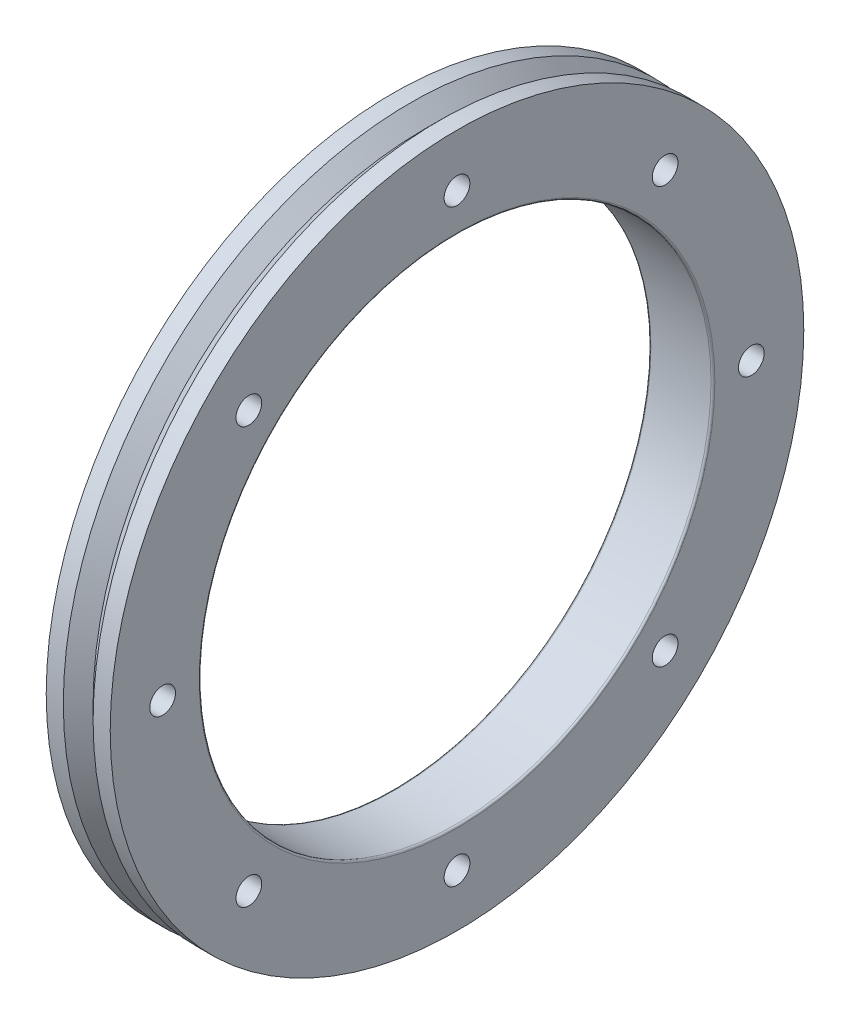
ISO-10303-21;
HEADER;
FILE_DESCRIPTION(('STEP AP214'),'2;1');
FILE_NAME('part.step','',(''),(''),'','','');
FILE_SCHEMA(('AUTOMOTIVE_DESIGN { 1 0 10303 214 1 1 1 1 }'));
ENDSEC;
DATA;
#1=APPLICATION_CONTEXT('core data for automotive mechanical design processes');
#2=APPLICATION_PROTOCOL_DEFINITION('international standard','automotive_design',2000,#1);
#3=PRODUCT_CONTEXT('',#1,'mechanical');
#4=PRODUCT('Part','Part','',(#3));
#5=PRODUCT_RELATED_PRODUCT_CATEGORY('part','',(#4));
#6=PRODUCT_DEFINITION_FORMATION('','',#4);
#7=PRODUCT_DEFINITION_CONTEXT('part definition',#1,'design');
#8=PRODUCT_DEFINITION('design','',#6,#7);
#9=PRODUCT_DEFINITION_SHAPE('','',#8);
#10=(LENGTH_UNIT() NAMED_UNIT(*) SI_UNIT(.MILLI.,.METRE.));
#11=(NAMED_UNIT(*) PLANE_ANGLE_UNIT() SI_UNIT($,.RADIAN.));
#12=(NAMED_UNIT(*) SI_UNIT($,.STERADIAN.) SOLID_ANGLE_UNIT());
#13=UNCERTAINTY_MEASURE_WITH_UNIT(LENGTH_MEASURE(1.E-05),#10,'distance_accuracy_value','');
#14=(GEOMETRIC_REPRESENTATION_CONTEXT(3) GLOBAL_UNCERTAINTY_ASSIGNED_CONTEXT((#13)) GLOBAL_UNIT_ASSIGNED_CONTEXT((#10,
#11,#12)) REPRESENTATION_CONTEXT('',''));
#15=CARTESIAN_POINT('',(0.,0.,0.));
#16=DIRECTION('',(0.,0.,1.));
#17=DIRECTION('',(1.,0.,0.));
#18=AXIS2_PLACEMENT_3D('',#15,#16,#17);
#19=CARTESIAN_POINT('',(5.,0.,0.));
#20=DIRECTION('',(1.,0.,0.));
#21=DIRECTION('',(0.,0.,-1.));
#22=AXIS2_PLACEMENT_3D('',#19,#20,#21);
#23=CYLINDRICAL_SURFACE('',#22,27.1);
#24=CARTESIAN_POINT('',(1.33578643762692,0.,0.));
#25=DIRECTION('',(1.,0.,0.));
#26=DIRECTION('',(0.,0.,1.));
#27=AXIS2_PLACEMENT_3D('',#24,#25,#26);
#28=CIRCLE('',#27,27.1);
#29=CARTESIAN_POINT('',(1.33578643762692,0.,27.1));
#30=VERTEX_POINT('',#29);
#31=EDGE_CURVE('E95',#30,#30,#28,.T.);
#32=ORIENTED_EDGE('',*,*,#31,.F.);
#33=EDGE_LOOP('',(#32));
#34=FACE_BOUND('',#33,.T.);
#35=CARTESIAN_POINT('',(0.,0.,0.));
#36=DIRECTION('',(1.,0.,0.));
#37=DIRECTION('',(0.,0.,-1.));
#38=AXIS2_PLACEMENT_3D('',#35,#36,#37);
#39=CIRCLE('',#38,27.1);
#40=CARTESIAN_POINT('',(0.,0.,-27.1));
#41=VERTEX_POINT('',#40);
#42=EDGE_CURVE('E92',#41,#41,#39,.T.);
#43=ORIENTED_EDGE('',*,*,#42,.T.);
#44=EDGE_LOOP('',(#43));
#45=FACE_BOUND('',#44,.T.);
#46=ADVANCED_FACE('F15',(#34,#45),#23,.T.);
#47=CARTESIAN_POINT('',(0.,27.1,0.));
#48=DIRECTION('',(-1.,0.,0.));
#49=DIRECTION('',(0.,0.,1.));
#50=AXIS2_PLACEMENT_3D('',#47,#48,#49);
#51=PLANE('',#50);
#52=CARTESIAN_POINT('',(0.,0.,23.));
#53=DIRECTION('',(1.,0.,0.));
#54=DIRECTION('',(0.,0.,-1.));
#55=AXIS2_PLACEMENT_3D('',#52,#53,#54);
#56=CIRCLE('',#55,1.0065);
#57=CARTESIAN_POINT('',(0.,0.,21.9935));
#58=VERTEX_POINT('',#57);
#59=EDGE_CURVE('E89',#58,#58,#56,.T.);
#60=ORIENTED_EDGE('',*,*,#59,.T.);
#61=EDGE_LOOP('',(#60));
#62=FACE_BOUND('',#61,.T.);
#63=CARTESIAN_POINT('',(0.,-16.263455967291,16.263455967291));
#64=DIRECTION('',(1.,0.,0.));
#65=DIRECTION('',(0.,0.,-1.));
#66=AXIS2_PLACEMENT_3D('',#63,#64,#65);
#67=CIRCLE('',#66,1.0065);
#68=CARTESIAN_POINT('',(0.,-16.263455967291,15.256955967291));
#69=VERTEX_POINT('',#68);
#70=EDGE_CURVE('E86',#69,#69,#67,.T.);
#71=ORIENTED_EDGE('',*,*,#70,.T.);
#72=EDGE_LOOP('',(#71));
#73=FACE_BOUND('',#72,.T.);
#74=CARTESIAN_POINT('',(0.,-23.,0.));
#75=DIRECTION('',(1.,0.,0.));
#76=DIRECTION('',(0.,0.,-1.));
#77=AXIS2_PLACEMENT_3D('',#74,#75,#76);
#78=CIRCLE('',#77,1.0065);
#79=CARTESIAN_POINT('',(0.,-23.,-1.0065));
#80=VERTEX_POINT('',#79);
#81=EDGE_CURVE('E83',#80,#80,#78,.T.);
#82=ORIENTED_EDGE('',*,*,#81,.T.);
#83=EDGE_LOOP('',(#82));
#84=FACE_BOUND('',#83,.T.);
#85=CARTESIAN_POINT('',(0.,-16.263455967291,-16.263455967291));
#86=DIRECTION('',(1.,0.,0.));
#87=DIRECTION('',(0.,0.,-1.));
#88=AXIS2_PLACEMENT_3D('',#85,#86,#87);
#89=CIRCLE('',#88,1.0065);
#90=CARTESIAN_POINT('',(0.,-16.263455967291,-17.269955967291));
#91=VERTEX_POINT('',#90);
#92=EDGE_CURVE('E80',#91,#91,#89,.T.);
#93=ORIENTED_EDGE('',*,*,#92,.T.);
#94=EDGE_LOOP('',(#93));
#95=FACE_BOUND('',#94,.T.);
#96=CARTESIAN_POINT('',(0.,0.,-23.));
#97=DIRECTION('',(1.,0.,0.));
#98=DIRECTION('',(0.,0.,-1.));
#99=AXIS2_PLACEMENT_3D('',#96,#97,#98);
#100=CIRCLE('',#99,1.0065);
#101=CARTESIAN_POINT('',(0.,0.,-24.0065));
#102=VERTEX_POINT('',#101);
#103=EDGE_CURVE('E77',#102,#102,#100,.T.);
#104=ORIENTED_EDGE('',*,*,#103,.T.);
#105=EDGE_LOOP('',(#104));
#106=FACE_BOUND('',#105,.T.);
#107=CARTESIAN_POINT('',(0.,16.263455967291,-16.263455967291));
#108=DIRECTION('',(1.,0.,0.));
#109=DIRECTION('',(0.,0.,-1.));
#110=AXIS2_PLACEMENT_3D('',#107,#108,#109);
#111=CIRCLE('',#110,1.0065);
#112=CARTESIAN_POINT('',(0.,16.263455967291,-17.269955967291));
#113=VERTEX_POINT('',#112);
#114=EDGE_CURVE('E74',#113,#113,#111,.T.);
#115=ORIENTED_EDGE('',*,*,#114,.T.);
#116=EDGE_LOOP('',(#115));
#117=FACE_BOUND('',#116,.T.);
#118=CARTESIAN_POINT('',(0.,16.263455967291,16.263455967291));
#119=DIRECTION('',(1.,0.,0.));
#120=DIRECTION('',(0.,0.,-1.));
#121=AXIS2_PLACEMENT_3D('',#118,#119,#120);
#122=CIRCLE('',#121,1.0065);
#123=CARTESIAN_POINT('',(0.,16.263455967291,15.256955967291));
#124=VERTEX_POINT('',#123);
#125=EDGE_CURVE('E71',#124,#124,#122,.T.);
#126=ORIENTED_EDGE('',*,*,#125,.T.);
#127=EDGE_LOOP('',(#126));
#128=FACE_BOUND('',#127,.T.);
#129=CARTESIAN_POINT('',(0.,23.,0.));
#130=DIRECTION('',(1.,0.,0.));
#131=DIRECTION('',(0.,0.,-1.));
#132=AXIS2_PLACEMENT_3D('',#129,#130,#131);
#133=CIRCLE('',#132,1.0065);
#134=CARTESIAN_POINT('',(0.,23.,-1.0065));
#135=VERTEX_POINT('',#134);
#136=EDGE_CURVE('E68',#135,#135,#133,.T.);
#137=ORIENTED_EDGE('',*,*,#136,.T.);
#138=EDGE_LOOP('',(#137));
#139=FACE_BOUND('',#138,.T.);
#140=CARTESIAN_POINT('',(0.,0.,0.));
#141=DIRECTION('',(1.,0.,0.));
#142=DIRECTION('',(0.,0.,-1.));
#143=AXIS2_PLACEMENT_3D('',#140,#141,#142);
#144=CIRCLE('',#143,20.15);
#145=CARTESIAN_POINT('',(0.,0.,-20.15));
#146=VERTEX_POINT('',#145);
#147=EDGE_CURVE('E65',#146,#146,#144,.T.);
#148=ORIENTED_EDGE('',*,*,#147,.T.);
#149=EDGE_LOOP('',(#148));
#150=FACE_BOUND('',#149,.T.);
#151=ORIENTED_EDGE('',*,*,#42,.F.);
#152=EDGE_LOOP('',(#151));
#153=FACE_BOUND('',#152,.T.);
#154=ADVANCED_FACE('F104',(#62,#73,#84,#95,#106,#117,#128,#139,#150,#153),#51,.T.);
#155=CARTESIAN_POINT('',(0.149999999999969,0.,0.));
#156=DIRECTION('',(1.,0.,0.));
#157=DIRECTION('',(0.,0.,-1.));
#158=AXIS2_PLACEMENT_3D('',#155,#156,#157);
#159=TOROIDAL_SURFACE('',#158,20.15,0.149999999999969);
#160=CARTESIAN_POINT('',(0.15,0.,0.));
#161=DIRECTION('',(1.,0.,0.));
#162=DIRECTION('',(0.,0.,-1.));
#163=AXIS2_PLACEMENT_3D('',#160,#161,#162);
#164=CIRCLE('',#163,20.);
#165=CARTESIAN_POINT('',(0.15,0.,-20.));
#166=VERTEX_POINT('',#165);
#167=EDGE_CURVE('E62',#166,#166,#164,.T.);
#168=ORIENTED_EDGE('',*,*,#167,.T.);
#169=EDGE_LOOP('',(#168));
#170=FACE_BOUND('',#169,.T.);
#171=ORIENTED_EDGE('',*,*,#147,.F.);
#172=EDGE_LOOP('',(#171));
#173=FACE_BOUND('',#172,.T.);
#174=ADVANCED_FACE('F110',(#170,#173),#159,.T.);
#175=CARTESIAN_POINT('',(5.,0.,0.));
#176=DIRECTION('',(1.,0.,0.));
#177=DIRECTION('',(0.,0.,-1.));
#178=AXIS2_PLACEMENT_3D('',#175,#176,#177);
#179=CYLINDRICAL_SURFACE('',#178,20.);
#180=CARTESIAN_POINT('',(4.85,0.,0.));
#181=DIRECTION('',(1.,0.,0.));
#182=DIRECTION('',(0.,0.,-1.));
#183=AXIS2_PLACEMENT_3D('',#180,#181,#182);
#184=CIRCLE('',#183,20.);
#185=CARTESIAN_POINT('',(4.85,0.,-20.));
#186=VERTEX_POINT('',#185);
#187=EDGE_CURVE('E59',#186,#186,#184,.T.);
#188=ORIENTED_EDGE('',*,*,#187,.T.);
#189=EDGE_LOOP('',(#188));
#190=FACE_BOUND('',#189,.T.);
#191=ORIENTED_EDGE('',*,*,#167,.F.);
#192=EDGE_LOOP('',(#191));
#193=FACE_BOUND('',#192,.T.);
#194=ADVANCED_FACE('F117',(#190,#193),#179,.F.);
#195=CARTESIAN_POINT('',(4.85000000000006,0.,0.));
#196=DIRECTION('',(1.,0.,0.));
#197=DIRECTION('',(0.,0.,-1.));
#198=AXIS2_PLACEMENT_3D('',#195,#196,#197);
#199=TOROIDAL_SURFACE('',#198,20.15,0.149999999999942);
#200=CARTESIAN_POINT('',(5.,0.,0.));
#201=DIRECTION('',(1.,0.,0.));
#202=DIRECTION('',(0.,0.,-1.));
#203=AXIS2_PLACEMENT_3D('',#200,#201,#202);
#204=CIRCLE('',#203,20.1499999752107);
#205=CARTESIAN_POINT('',(5.,0.,-20.1499999752107));
#206=VERTEX_POINT('',#205);
#207=EDGE_CURVE('E56',#206,#206,#204,.T.);
#208=ORIENTED_EDGE('',*,*,#207,.T.);
#209=EDGE_LOOP('',(#208));
#210=FACE_BOUND('',#209,.T.);
#211=ORIENTED_EDGE('',*,*,#187,.F.);
#212=EDGE_LOOP('',(#211));
#213=FACE_BOUND('',#212,.T.);
#214=ADVANCED_FACE('F124',(#210,#213),#199,.T.);
#215=CARTESIAN_POINT('',(5.,20.15,0.));
#216=DIRECTION('',(1.,0.,0.));
#217=DIRECTION('',(0.,0.,-1.));
#218=AXIS2_PLACEMENT_3D('',#215,#216,#217);
#219=PLANE('',#218);
#220=CARTESIAN_POINT('',(5.,0.,23.));
#221=DIRECTION('',(1.,0.,0.));
#222=DIRECTION('',(0.,0.,-1.));
#223=AXIS2_PLACEMENT_3D('',#220,#221,#222);
#224=CIRCLE('',#223,1.0065);
#225=CARTESIAN_POINT('',(5.,0.,21.9935));
#226=VERTEX_POINT('',#225);
#227=EDGE_CURVE('E53',#226,#226,#224,.T.);
#228=ORIENTED_EDGE('',*,*,#227,.F.);
#229=EDGE_LOOP('',(#228));
#230=FACE_BOUND('',#229,.T.);
#231=CARTESIAN_POINT('',(5.,-16.263455967291,16.263455967291));
#232=DIRECTION('',(1.,0.,0.));
#233=DIRECTION('',(0.,0.,-1.));
#234=AXIS2_PLACEMENT_3D('',#231,#232,#233);
#235=CIRCLE('',#234,1.0065);
#236=CARTESIAN_POINT('',(5.,-16.263455967291,15.256955967291));
#237=VERTEX_POINT('',#236);
#238=EDGE_CURVE('E50',#237,#237,#235,.T.);
#239=ORIENTED_EDGE('',*,*,#238,.F.);
#240=EDGE_LOOP('',(#239));
#241=FACE_BOUND('',#240,.T.);
#242=CARTESIAN_POINT('',(5.,-23.,0.));
#243=DIRECTION('',(1.,0.,0.));
#244=DIRECTION('',(0.,0.,-1.));
#245=AXIS2_PLACEMENT_3D('',#242,#243,#244);
#246=CIRCLE('',#245,1.0065);
#247=CARTESIAN_POINT('',(5.,-23.,-1.0065));
#248=VERTEX_POINT('',#247);
#249=EDGE_CURVE('E47',#248,#248,#246,.T.);
#250=ORIENTED_EDGE('',*,*,#249,.F.);
#251=EDGE_LOOP('',(#250));
#252=FACE_BOUND('',#251,.T.);
#253=CARTESIAN_POINT('',(5.,-16.263455967291,-16.263455967291));
#254=DIRECTION('',(1.,0.,0.));
#255=DIRECTION('',(0.,0.,-1.));
#256=AXIS2_PLACEMENT_3D('',#253,#254,#255);
#257=CIRCLE('',#256,1.0065);
#258=CARTESIAN_POINT('',(5.,-16.263455967291,-17.269955967291));
#259=VERTEX_POINT('',#258);
#260=EDGE_CURVE('E44',#259,#259,#257,.T.);
#261=ORIENTED_EDGE('',*,*,#260,.F.);
#262=EDGE_LOOP('',(#261));
#263=FACE_BOUND('',#262,.T.);
#264=CARTESIAN_POINT('',(5.,0.,-23.));
#265=DIRECTION('',(1.,0.,0.));
#266=DIRECTION('',(0.,0.,-1.));
#267=AXIS2_PLACEMENT_3D('',#264,#265,#266);
#268=CIRCLE('',#267,1.0065);
#269=CARTESIAN_POINT('',(5.,0.,-24.0065));
#270=VERTEX_POINT('',#269);
#271=EDGE_CURVE('E41',#270,#270,#268,.T.);
#272=ORIENTED_EDGE('',*,*,#271,.F.);
#273=EDGE_LOOP('',(#272));
#274=FACE_BOUND('',#273,.T.);
#275=CARTESIAN_POINT('',(5.,16.263455967291,-16.263455967291));
#276=DIRECTION('',(1.,0.,0.));
#277=DIRECTION('',(0.,0.,-1.));
#278=AXIS2_PLACEMENT_3D('',#275,#276,#277);
#279=CIRCLE('',#278,1.0065);
#280=CARTESIAN_POINT('',(5.,16.263455967291,-17.269955967291));
#281=VERTEX_POINT('',#280);
#282=EDGE_CURVE('E38',#281,#281,#279,.T.);
#283=ORIENTED_EDGE('',*,*,#282,.F.);
#284=EDGE_LOOP('',(#283));
#285=FACE_BOUND('',#284,.T.);
#286=CARTESIAN_POINT('',(5.,16.263455967291,16.263455967291));
#287=DIRECTION('',(1.,0.,0.));
#288=DIRECTION('',(0.,0.,-1.));
#289=AXIS2_PLACEMENT_3D('',#286,#287,#288);
#290=CIRCLE('',#289,1.0065);
#291=CARTESIAN_POINT('',(5.,16.263455967291,15.256955967291));
#292=VERTEX_POINT('',#291);
#293=EDGE_CURVE('E35',#292,#292,#290,.T.);
#294=ORIENTED_EDGE('',*,*,#293,.F.);
#295=EDGE_LOOP('',(#294));
#296=FACE_BOUND('',#295,.T.);
#297=CARTESIAN_POINT('',(5.,23.,0.));
#298=DIRECTION('',(1.,0.,0.));
#299=DIRECTION('',(0.,0.,-1.));
#300=AXIS2_PLACEMENT_3D('',#297,#298,#299);
#301=CIRCLE('',#300,1.0065);
#302=CARTESIAN_POINT('',(5.,23.,-1.0065));
#303=VERTEX_POINT('',#302);
#304=EDGE_CURVE('E30',#303,#303,#301,.T.);
#305=ORIENTED_EDGE('',*,*,#304,.F.);
#306=EDGE_LOOP('',(#305));
#307=FACE_BOUND('',#306,.T.);
#308=CARTESIAN_POINT('',(5.,0.,0.));
#309=DIRECTION('',(1.,0.,0.));
#310=DIRECTION('',(0.,0.,-1.));
#311=AXIS2_PLACEMENT_3D('',#308,#309,#310);
#312=CIRCLE('',#311,27.1);
#313=CARTESIAN_POINT('',(5.,0.,-27.1));
#314=VERTEX_POINT('',#313);
#315=EDGE_CURVE('E26',#314,#314,#312,.T.);
#316=ORIENTED_EDGE('',*,*,#315,.T.);
#317=EDGE_LOOP('',(#316));
#318=FACE_BOUND('',#317,.T.);
#319=ORIENTED_EDGE('',*,*,#207,.F.);
#320=EDGE_LOOP('',(#319));
#321=FACE_BOUND('',#320,.T.);
#322=ADVANCED_FACE('F128',(#230,#241,#252,#263,#274,#285,#296,#307,#318,#321),#219,.T.);
#323=CARTESIAN_POINT('',(3.66421356237308,0.,0.));
#324=DIRECTION('',(-1.,0.,0.));
#325=DIRECTION('',(0.,0.,-1.));
#326=AXIS2_PLACEMENT_3D('',#323,#324,#325);
#327=CIRCLE('',#326,27.1);
#328=CARTESIAN_POINT('',(3.66421356237308,0.,-27.1));
#329=VERTEX_POINT('',#328);
#330=EDGE_CURVE('E22',#329,#329,#327,.T.);
#331=ORIENTED_EDGE('',*,*,#330,.F.);
#332=EDGE_LOOP('',(#331));
#333=FACE_BOUND('',#332,.T.);
#334=ORIENTED_EDGE('',*,*,#315,.F.);
#335=EDGE_LOOP('',(#334));
#336=FACE_BOUND('',#335,.T.);
#337=ADVANCED_FACE('F106',(#333,#336),#23,.T.);
#338=CARTESIAN_POINT('',(1.0857864376269,0.,0.));
#339=DIRECTION('',(-1.,0.,0.));
#340=DIRECTION('',(0.,0.,1.));
#341=AXIS2_PLACEMENT_3D('',#338,#339,#340);
#342=CONICAL_SURFACE('',#341,27.35,0.785398163397412);
#343=ORIENTED_EDGE('',*,*,#31,.T.);
#344=EDGE_LOOP('',(#343));
#345=FACE_BOUND('',#344,.T.);
#346=CARTESIAN_POINT('',(2.5,0.,0.));
#347=DIRECTION('',(1.,0.,0.));
#348=DIRECTION('',(0.,0.,-1.));
#349=AXIS2_PLACEMENT_3D('',#346,#347,#348);
#350=CIRCLE('',#349,25.935786437627);
#351=CARTESIAN_POINT('',(2.5,0.,-25.935786437627));
#352=VERTEX_POINT('',#351);
#353=EDGE_CURVE('E10',#352,#352,#350,.T.);
#354=ORIENTED_EDGE('',*,*,#353,.F.);
#355=EDGE_LOOP('',(#354));
#356=FACE_BOUND('',#355,.T.);
#357=ADVANCED_FACE('F99',(#345,#356),#342,.T.);
#358=CARTESIAN_POINT('',(2.5,0.,0.));
#359=DIRECTION('',(1.,0.,0.));
#360=DIRECTION('',(0.,0.,-1.));
#361=AXIS2_PLACEMENT_3D('',#358,#359,#360);
#362=CONICAL_SURFACE('',#361,25.935786437627,0.785398163397412);
#363=ORIENTED_EDGE('',*,*,#330,.T.);
#364=EDGE_LOOP('',(#363));
#365=FACE_BOUND('',#364,.T.);
#366=ORIENTED_EDGE('',*,*,#353,.T.);
#367=EDGE_LOOP('',(#366));
#368=FACE_BOUND('',#367,.T.);
#369=ADVANCED_FACE('F135',(#365,#368),#362,.T.);
#370=CARTESIAN_POINT('',(5.,23.,0.));
#371=DIRECTION('',(1.,0.,0.));
#372=DIRECTION('',(0.,0.,-1.));
#373=AXIS2_PLACEMENT_3D('',#370,#371,#372);
#374=CYLINDRICAL_SURFACE('',#373,1.0065);
#375=ORIENTED_EDGE('',*,*,#304,.T.);
#376=EDGE_LOOP('',(#375));
#377=FACE_BOUND('',#376,.T.);
#378=ORIENTED_EDGE('',*,*,#136,.F.);
#379=EDGE_LOOP('',(#378));
#380=FACE_BOUND('',#379,.T.);
#381=ADVANCED_FACE('F138',(#377,#380),#374,.F.);
#382=CARTESIAN_POINT('',(5.,16.263455967291,16.263455967291));
#383=DIRECTION('',(1.,0.,0.));
#384=DIRECTION('',(0.,0.,-1.));
#385=AXIS2_PLACEMENT_3D('',#382,#383,#384);
#386=CYLINDRICAL_SURFACE('',#385,1.0065);
#387=ORIENTED_EDGE('',*,*,#293,.T.);
#388=EDGE_LOOP('',(#387));
#389=FACE_BOUND('',#388,.T.);
#390=ORIENTED_EDGE('',*,*,#125,.F.);
#391=EDGE_LOOP('',(#390));
#392=FACE_BOUND('',#391,.T.);
#393=ADVANCED_FACE('F141',(#389,#392),#386,.F.);
#394=CARTESIAN_POINT('',(5.,16.263455967291,-16.263455967291));
#395=DIRECTION('',(1.,0.,0.));
#396=DIRECTION('',(0.,0.,-1.));
#397=AXIS2_PLACEMENT_3D('',#394,#395,#396);
#398=CYLINDRICAL_SURFACE('',#397,1.0065);
#399=ORIENTED_EDGE('',*,*,#282,.T.);
#400=EDGE_LOOP('',(#399));
#401=FACE_BOUND('',#400,.T.);
#402=ORIENTED_EDGE('',*,*,#114,.F.);
#403=EDGE_LOOP('',(#402));
#404=FACE_BOUND('',#403,.T.);
#405=ADVANCED_FACE('F145',(#401,#404),#398,.F.);
#406=CARTESIAN_POINT('',(5.,0.,-23.));
#407=DIRECTION('',(1.,0.,0.));
#408=DIRECTION('',(0.,0.,-1.));
#409=AXIS2_PLACEMENT_3D('',#406,#407,#408);
#410=CYLINDRICAL_SURFACE('',#409,1.0065);
#411=ORIENTED_EDGE('',*,*,#271,.T.);
#412=EDGE_LOOP('',(#411));
#413=FACE_BOUND('',#412,.T.);
#414=ORIENTED_EDGE('',*,*,#103,.F.);
#415=EDGE_LOOP('',(#414));
#416=FACE_BOUND('',#415,.T.);
#417=ADVANCED_FACE('F149',(#413,#416),#410,.F.);
#418=CARTESIAN_POINT('',(5.,-16.263455967291,-16.263455967291));
#419=DIRECTION('',(1.,0.,0.));
#420=DIRECTION('',(0.,0.,-1.));
#421=AXIS2_PLACEMENT_3D('',#418,#419,#420);
#422=CYLINDRICAL_SURFACE('',#421,1.0065);
#423=ORIENTED_EDGE('',*,*,#260,.T.);
#424=EDGE_LOOP('',(#423));
#425=FACE_BOUND('',#424,.T.);
#426=ORIENTED_EDGE('',*,*,#92,.F.);
#427=EDGE_LOOP('',(#426));
#428=FACE_BOUND('',#427,.T.);
#429=ADVANCED_FACE('F153',(#425,#428),#422,.F.);
#430=CARTESIAN_POINT('',(5.,-23.,0.));
#431=DIRECTION('',(1.,0.,0.));
#432=DIRECTION('',(0.,0.,-1.));
#433=AXIS2_PLACEMENT_3D('',#430,#431,#432);
#434=CYLINDRICAL_SURFACE('',#433,1.0065);
#435=ORIENTED_EDGE('',*,*,#249,.T.);
#436=EDGE_LOOP('',(#435));
#437=FACE_BOUND('',#436,.T.);
#438=ORIENTED_EDGE('',*,*,#81,.F.);
#439=EDGE_LOOP('',(#438));
#440=FACE_BOUND('',#439,.T.);
#441=ADVANCED_FACE('F157',(#437,#440),#434,.F.);
#442=CARTESIAN_POINT('',(5.,-16.263455967291,16.263455967291));
#443=DIRECTION('',(1.,0.,0.));
#444=DIRECTION('',(0.,0.,-1.));
#445=AXIS2_PLACEMENT_3D('',#442,#443,#444);
#446=CYLINDRICAL_SURFACE('',#445,1.0065);
#447=ORIENTED_EDGE('',*,*,#238,.T.);
#448=EDGE_LOOP('',(#447));
#449=FACE_BOUND('',#448,.T.);
#450=ORIENTED_EDGE('',*,*,#70,.F.);
#451=EDGE_LOOP('',(#450));
#452=FACE_BOUND('',#451,.T.);
#453=ADVANCED_FACE('F160',(#449,#452),#446,.F.);
#454=CARTESIAN_POINT('',(5.,0.,23.));
#455=DIRECTION('',(1.,0.,0.));
#456=DIRECTION('',(0.,0.,-1.));
#457=AXIS2_PLACEMENT_3D('',#454,#455,#456);
#458=CYLINDRICAL_SURFACE('',#457,1.0065);
#459=ORIENTED_EDGE('',*,*,#227,.T.);
#460=EDGE_LOOP('',(#459));
#461=FACE_BOUND('',#460,.T.);
#462=ORIENTED_EDGE('',*,*,#59,.F.);
#463=EDGE_LOOP('',(#462));
#464=FACE_BOUND('',#463,.T.);
#465=ADVANCED_FACE('F17',(#461,#464),#458,.F.);
#466=CLOSED_SHELL('',(#46,#154,#174,#194,#214,#322,#337,#357,#369,#381,#393,#405,#417,#429,#441,
#453,#465));
#467=MANIFOLD_SOLID_BREP('B1',#466);
#468=ADVANCED_BREP_SHAPE_REPRESENTATION('',(#18,#467),#14);
#469=SHAPE_DEFINITION_REPRESENTATION(#9,#468);
ENDSEC;
END-ISO-10303-21;
